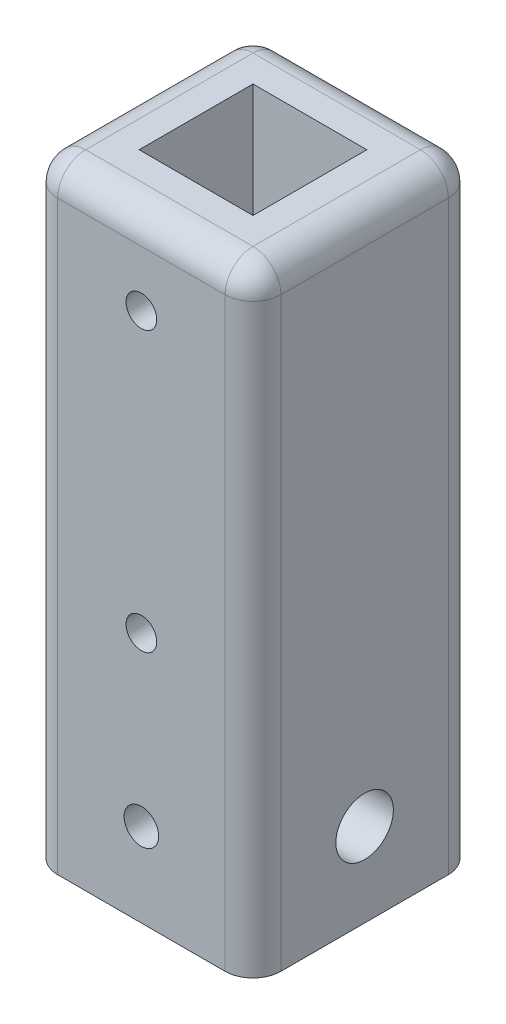
ISO-10303-21;
HEADER;
FILE_DESCRIPTION(('STEP AP214'),'2;1');
FILE_NAME('part.step','',(''),(''),'','','');
FILE_SCHEMA(('AUTOMOTIVE_DESIGN { 1 0 10303 214 1 1 1 1 }'));
ENDSEC;
DATA;
#1=APPLICATION_CONTEXT('core data for automotive mechanical design processes');
#2=APPLICATION_PROTOCOL_DEFINITION('international standard','automotive_design',2000,#1);
#3=PRODUCT_CONTEXT('',#1,'mechanical');
#4=PRODUCT('Part','Part','',(#3));
#5=PRODUCT_RELATED_PRODUCT_CATEGORY('part','',(#4));
#6=PRODUCT_DEFINITION_FORMATION('','',#4);
#7=PRODUCT_DEFINITION_CONTEXT('part definition',#1,'design');
#8=PRODUCT_DEFINITION('design','',#6,#7);
#9=PRODUCT_DEFINITION_SHAPE('','',#8);
#10=(LENGTH_UNIT() NAMED_UNIT(*) SI_UNIT(.MILLI.,.METRE.));
#11=(NAMED_UNIT(*) PLANE_ANGLE_UNIT() SI_UNIT($,.RADIAN.));
#12=(NAMED_UNIT(*) SI_UNIT($,.STERADIAN.) SOLID_ANGLE_UNIT());
#13=UNCERTAINTY_MEASURE_WITH_UNIT(LENGTH_MEASURE(1.E-05),#10,'distance_accuracy_value','');
#14=(GEOMETRIC_REPRESENTATION_CONTEXT(3) GLOBAL_UNCERTAINTY_ASSIGNED_CONTEXT((#13)) GLOBAL_UNIT_ASSIGNED_CONTEXT((#10,
#11,#12)) REPRESENTATION_CONTEXT('',''));
#15=CARTESIAN_POINT('',(0.,0.,0.));
#16=DIRECTION('',(0.,0.,1.));
#17=DIRECTION('',(1.,0.,0.));
#18=AXIS2_PLACEMENT_3D('',#15,#16,#17);
#19=CARTESIAN_POINT('',(0.,80.,0.));
#20=DIRECTION('',(0.,-1.,0.));
#21=DIRECTION('',(0.,0.,-1.));
#22=AXIS2_PLACEMENT_3D('',#19,#20,#21);
#23=PLANE('',#22);
#24=DIRECTION('',(0.,0.,-1.));
#25=VECTOR('',#24,1.);
#26=CARTESIAN_POINT('',(25.2,80.,0.));
#27=LINE('',#26,#25);
#28=CARTESIAN_POINT('',(25.2,80.,4.8));
#29=VERTEX_POINT('',#28);
#30=CARTESIAN_POINT('',(25.2,80.,-25.2));
#31=VERTEX_POINT('',#30);
#32=EDGE_CURVE('E223',#29,#31,#27,.T.);
#33=ORIENTED_EDGE('',*,*,#32,.T.);
#34=DIRECTION('',(-1.,0.,0.));
#35=VECTOR('',#34,1.);
#36=CARTESIAN_POINT('',(0.,80.,-25.2));
#37=LINE('',#36,#35);
#38=CARTESIAN_POINT('',(-4.80000000000001,80.,-25.2));
#39=VERTEX_POINT('',#38);
#40=EDGE_CURVE('E225',#31,#39,#37,.T.);
#41=ORIENTED_EDGE('',*,*,#40,.T.);
#42=DIRECTION('',(0.,0.,1.));
#43=VECTOR('',#42,1.);
#44=CARTESIAN_POINT('',(-4.8,80.,0.));
#45=LINE('',#44,#43);
#46=CARTESIAN_POINT('',(-4.8,80.,4.8));
#47=VERTEX_POINT('',#46);
#48=EDGE_CURVE('E219',#39,#47,#45,.T.);
#49=ORIENTED_EDGE('',*,*,#48,.T.);
#50=DIRECTION('',(1.,0.,0.));
#51=VECTOR('',#50,1.);
#52=CARTESIAN_POINT('',(0.,80.,4.8));
#53=LINE('',#52,#51);
#54=EDGE_CURVE('E221',#47,#29,#53,.T.);
#55=ORIENTED_EDGE('',*,*,#54,.T.);
#56=EDGE_LOOP('',(#33,#41,#49,#55));
#57=FACE_BOUND('',#56,.T.);
#58=DIRECTION('',(0.,0.,1.));
#59=VECTOR('',#58,1.);
#60=CARTESIAN_POINT('',(0.,80.,0.));
#61=LINE('',#60,#59);
#62=CARTESIAN_POINT('',(0.,80.,-20.4));
#63=VERTEX_POINT('',#62);
#64=CARTESIAN_POINT('',(0.,80.,0.));
#65=VERTEX_POINT('',#64);
#66=EDGE_CURVE('E151',#63,#65,#61,.T.);
#67=ORIENTED_EDGE('',*,*,#66,.F.);
#68=DIRECTION('',(-1.,0.,0.));
#69=VECTOR('',#68,1.);
#70=CARTESIAN_POINT('',(0.,80.,-20.4));
#71=LINE('',#70,#69);
#72=CARTESIAN_POINT('',(20.4,80.,-20.4));
#73=VERTEX_POINT('',#72);
#74=EDGE_CURVE('E171',#73,#63,#71,.T.);
#75=ORIENTED_EDGE('',*,*,#74,.F.);
#76=DIRECTION('',(0.,0.,-1.));
#77=VECTOR('',#76,1.);
#78=CARTESIAN_POINT('',(20.4,80.,0.));
#79=LINE('',#78,#77);
#80=CARTESIAN_POINT('',(20.4,80.,0.));
#81=VERTEX_POINT('',#80);
#82=EDGE_CURVE('E160',#81,#73,#79,.T.);
#83=ORIENTED_EDGE('',*,*,#82,.F.);
#84=DIRECTION('',(1.,0.,0.));
#85=VECTOR('',#84,1.);
#86=CARTESIAN_POINT('',(0.,80.,0.));
#87=LINE('',#86,#85);
#88=EDGE_CURVE('E293',#65,#81,#87,.T.);
#89=ORIENTED_EDGE('',*,*,#88,.F.);
#90=EDGE_LOOP('',(#67,#75,#83,#89));
#91=FACE_BOUND('',#90,.T.);
#92=ADVANCED_FACE('F38',(#57,#91),#23,.F.);
#93=CARTESIAN_POINT('',(-9.8,80.,9.8));
#94=DIRECTION('',(1.,0.,0.));
#95=DIRECTION('',(0.,0.,-1.));
#96=AXIS2_PLACEMENT_3D('',#93,#94,#95);
#97=PLANE('',#96);
#98=CARTESIAN_POINT('',(-9.8,-15.,-10.2));
#99=DIRECTION('',(-1.,0.,0.));
#100=DIRECTION('',(0.,0.,1.));
#101=AXIS2_PLACEMENT_3D('',#98,#99,#100);
#102=CIRCLE('',#101,5.15);
#103=CARTESIAN_POINT('',(-9.8,-15.,-5.04999999999999));
#104=VERTEX_POINT('',#103);
#105=EDGE_CURVE('E439',#104,#104,#102,.T.);
#106=ORIENTED_EDGE('',*,*,#105,.F.);
#107=EDGE_LOOP('',(#106));
#108=FACE_BOUND('',#107,.T.);
#109=DIRECTION('',(0.,-1.,0.));
#110=VECTOR('',#109,1.);
#111=CARTESIAN_POINT('',(-9.8,80.,4.8));
#112=LINE('',#111,#110);
#113=CARTESIAN_POINT('',(-9.8,-30.,4.8));
#114=VERTEX_POINT('',#113);
#115=CARTESIAN_POINT('',(-9.8,75.,4.8));
#116=VERTEX_POINT('',#115);
#117=EDGE_CURVE('E177',#114,#116,#112,.F.);
#118=ORIENTED_EDGE('',*,*,#117,.T.);
#119=DIRECTION('',(0.,0.,1.));
#120=VECTOR('',#119,1.);
#121=CARTESIAN_POINT('',(-9.8,75.,9.8));
#122=LINE('',#121,#120);
#123=CARTESIAN_POINT('',(-9.80000000000001,75.,-25.2));
#124=VERTEX_POINT('',#123);
#125=EDGE_CURVE('E11',#116,#124,#122,.F.);
#126=ORIENTED_EDGE('',*,*,#125,.T.);
#127=DIRECTION('',(0.,-1.,0.));
#128=VECTOR('',#127,1.);
#129=CARTESIAN_POINT('',(-9.80000000000001,80.,-25.2));
#130=LINE('',#129,#128);
#131=CARTESIAN_POINT('',(-9.80000000000001,-30.,-25.2));
#132=VERTEX_POINT('',#131);
#133=EDGE_CURVE('E188',#124,#132,#130,.T.);
#134=ORIENTED_EDGE('',*,*,#133,.T.);
#135=DIRECTION('',(0.,0.,-1.));
#136=VECTOR('',#135,1.);
#137=CARTESIAN_POINT('',(-9.8,-30.,0.));
#138=LINE('',#137,#136);
#139=EDGE_CURVE('E289',#114,#132,#138,.T.);
#140=ORIENTED_EDGE('',*,*,#139,.F.);
#141=EDGE_LOOP('',(#118,#126,#134,#140));
#142=FACE_BOUND('',#141,.T.);
#143=ADVANCED_FACE('F305',(#108,#142),#97,.F.);
#144=CARTESIAN_POINT('',(-9.8,80.,9.8));
#145=DIRECTION('',(0.,0.,-1.));
#146=DIRECTION('',(-1.,0.,0.));
#147=AXIS2_PLACEMENT_3D('',#144,#145,#146);
#148=PLANE('',#147);
#149=CARTESIAN_POINT('',(10.2,-15.,9.8));
#150=DIRECTION('',(0.,0.,1.));
#151=DIRECTION('',(1.,0.,0.));
#152=AXIS2_PLACEMENT_3D('',#149,#150,#151);
#153=CIRCLE('',#152,3.1);
#154=CARTESIAN_POINT('',(13.3,-15.,9.8));
#155=VERTEX_POINT('',#154);
#156=EDGE_CURVE('E390',#155,#155,#153,.T.);
#157=ORIENTED_EDGE('',*,*,#156,.F.);
#158=EDGE_LOOP('',(#157));
#159=FACE_BOUND('',#158,.T.);
#160=CARTESIAN_POINT('',(10.2,15.,9.8));
#161=DIRECTION('',(0.,0.,-1.));
#162=DIRECTION('',(-1.,0.,0.));
#163=AXIS2_PLACEMENT_3D('',#160,#161,#162);
#164=CIRCLE('',#163,2.75);
#165=CARTESIAN_POINT('',(7.45,15.,9.8));
#166=VERTEX_POINT('',#165);
#167=EDGE_CURVE('E182',#166,#166,#164,.T.);
#168=ORIENTED_EDGE('',*,*,#167,.T.);
#169=EDGE_LOOP('',(#168));
#170=FACE_BOUND('',#169,.T.);
#171=CARTESIAN_POINT('',(10.2,65.,9.8));
#172=DIRECTION('',(0.,0.,-1.));
#173=DIRECTION('',(-1.,0.,0.));
#174=AXIS2_PLACEMENT_3D('',#171,#172,#173);
#175=CIRCLE('',#174,2.75);
#176=CARTESIAN_POINT('',(7.44999999999999,65.,9.8));
#177=VERTEX_POINT('',#176);
#178=EDGE_CURVE('E427',#177,#177,#175,.T.);
#179=ORIENTED_EDGE('',*,*,#178,.T.);
#180=EDGE_LOOP('',(#179));
#181=FACE_BOUND('',#180,.T.);
#182=DIRECTION('',(0.,-1.,0.));
#183=VECTOR('',#182,1.);
#184=CARTESIAN_POINT('',(25.2,80.,9.8));
#185=LINE('',#184,#183);
#186=CARTESIAN_POINT('',(25.2,-30.,9.8));
#187=VERTEX_POINT('',#186);
#188=CARTESIAN_POINT('',(25.2,75.,9.8));
#189=VERTEX_POINT('',#188);
#190=EDGE_CURVE('E203',#187,#189,#185,.F.);
#191=ORIENTED_EDGE('',*,*,#190,.T.);
#192=DIRECTION('',(1.,0.,0.));
#193=VECTOR('',#192,1.);
#194=CARTESIAN_POINT('',(-9.8,75.,9.8));
#195=LINE('',#194,#193);
#196=CARTESIAN_POINT('',(-4.8,75.,9.8));
#197=VERTEX_POINT('',#196);
#198=EDGE_CURVE('E62',#189,#197,#195,.F.);
#199=ORIENTED_EDGE('',*,*,#198,.T.);
#200=DIRECTION('',(0.,-1.,0.));
#201=VECTOR('',#200,1.);
#202=CARTESIAN_POINT('',(-4.8,80.,9.8));
#203=LINE('',#202,#201);
#204=CARTESIAN_POINT('',(-4.8,-30.,9.8));
#205=VERTEX_POINT('',#204);
#206=EDGE_CURVE('E205',#197,#205,#203,.T.);
#207=ORIENTED_EDGE('',*,*,#206,.T.);
#208=DIRECTION('',(1.,0.,0.));
#209=VECTOR('',#208,1.);
#210=CARTESIAN_POINT('',(0.,-30.,9.8));
#211=LINE('',#210,#209);
#212=EDGE_CURVE('E275',#205,#187,#211,.T.);
#213=ORIENTED_EDGE('',*,*,#212,.T.);
#214=EDGE_LOOP('',(#191,#199,#207,#213));
#215=FACE_BOUND('',#214,.T.);
#216=ADVANCED_FACE('F273',(#159,#170,#181,#215),#148,.F.);
#217=CARTESIAN_POINT('',(30.2,80.,9.8));
#218=DIRECTION('',(-1.,0.,0.));
#219=DIRECTION('',(0.,0.,1.));
#220=AXIS2_PLACEMENT_3D('',#217,#218,#219);
#221=PLANE('',#220);
#222=CARTESIAN_POINT('',(30.2,-15.,-10.2));
#223=DIRECTION('',(-1.,0.,0.));
#224=DIRECTION('',(0.,0.,1.));
#225=AXIS2_PLACEMENT_3D('',#222,#223,#224);
#226=CIRCLE('',#225,5.15);
#227=CARTESIAN_POINT('',(30.2,-15.,-5.05));
#228=VERTEX_POINT('',#227);
#229=EDGE_CURVE('E434',#228,#228,#226,.T.);
#230=ORIENTED_EDGE('',*,*,#229,.T.);
#231=EDGE_LOOP('',(#230));
#232=FACE_BOUND('',#231,.T.);
#233=DIRECTION('',(0.,-1.,0.));
#234=VECTOR('',#233,1.);
#235=CARTESIAN_POINT('',(30.2,80.,-25.2));
#236=LINE('',#235,#234);
#237=CARTESIAN_POINT('',(30.2,-30.,-25.2));
#238=VERTEX_POINT('',#237);
#239=CARTESIAN_POINT('',(30.2,75.,-25.2));
#240=VERTEX_POINT('',#239);
#241=EDGE_CURVE('E207',#238,#240,#236,.F.);
#242=ORIENTED_EDGE('',*,*,#241,.T.);
#243=DIRECTION('',(0.,0.,-1.));
#244=VECTOR('',#243,1.);
#245=CARTESIAN_POINT('',(30.2,75.,9.8));
#246=LINE('',#245,#244);
#247=CARTESIAN_POINT('',(30.2,75.,4.8));
#248=VERTEX_POINT('',#247);
#249=EDGE_CURVE('E232',#240,#248,#246,.F.);
#250=ORIENTED_EDGE('',*,*,#249,.T.);
#251=DIRECTION('',(0.,-1.,0.));
#252=VECTOR('',#251,1.);
#253=CARTESIAN_POINT('',(30.2,80.,4.8));
#254=LINE('',#253,#252);
#255=CARTESIAN_POINT('',(30.2,-30.,4.8));
#256=VERTEX_POINT('',#255);
#257=EDGE_CURVE('E210',#248,#256,#254,.T.);
#258=ORIENTED_EDGE('',*,*,#257,.T.);
#259=DIRECTION('',(0.,0.,-1.));
#260=VECTOR('',#259,1.);
#261=CARTESIAN_POINT('',(30.2,-30.,0.));
#262=LINE('',#261,#260);
#263=EDGE_CURVE('E278',#256,#238,#262,.T.);
#264=ORIENTED_EDGE('',*,*,#263,.T.);
#265=EDGE_LOOP('',(#242,#250,#258,#264));
#266=FACE_BOUND('',#265,.T.);
#267=ADVANCED_FACE('F319',(#232,#266),#221,.F.);
#268=CARTESIAN_POINT('',(-9.80000000000001,80.,-30.2));
#269=DIRECTION('',(0.,0.,1.));
#270=DIRECTION('',(1.,0.,0.));
#271=AXIS2_PLACEMENT_3D('',#268,#269,#270);
#272=PLANE('',#271);
#273=CARTESIAN_POINT('',(10.2,15.,-30.2));
#274=DIRECTION('',(0.,0.,-1.));
#275=DIRECTION('',(-1.,0.,0.));
#276=AXIS2_PLACEMENT_3D('',#273,#274,#275);
#277=CIRCLE('',#276,2.75);
#278=CARTESIAN_POINT('',(7.45,15.,-30.2));
#279=VERTEX_POINT('',#278);
#280=EDGE_CURVE('E430',#279,#279,#277,.T.);
#281=ORIENTED_EDGE('',*,*,#280,.F.);
#282=EDGE_LOOP('',(#281));
#283=FACE_BOUND('',#282,.T.);
#284=CARTESIAN_POINT('',(10.2,65.,-30.2));
#285=DIRECTION('',(0.,0.,-1.));
#286=DIRECTION('',(-1.,0.,0.));
#287=AXIS2_PLACEMENT_3D('',#284,#285,#286);
#288=CIRCLE('',#287,2.75);
#289=CARTESIAN_POINT('',(7.44999999999999,65.,-30.2));
#290=VERTEX_POINT('',#289);
#291=EDGE_CURVE('E431',#290,#290,#288,.T.);
#292=ORIENTED_EDGE('',*,*,#291,.F.);
#293=EDGE_LOOP('',(#292));
#294=FACE_BOUND('',#293,.T.);
#295=DIRECTION('',(0.,-1.,0.));
#296=VECTOR('',#295,1.);
#297=CARTESIAN_POINT('',(-4.80000000000001,80.,-30.2));
#298=LINE('',#297,#296);
#299=CARTESIAN_POINT('',(-4.80000000000001,-30.,-30.2));
#300=VERTEX_POINT('',#299);
#301=CARTESIAN_POINT('',(-4.80000000000001,75.,-30.2));
#302=VERTEX_POINT('',#301);
#303=EDGE_CURVE('E200',#300,#302,#298,.F.);
#304=ORIENTED_EDGE('',*,*,#303,.T.);
#305=DIRECTION('',(-1.,0.,0.));
#306=VECTOR('',#305,1.);
#307=CARTESIAN_POINT('',(-9.80000000000001,75.,-30.2));
#308=LINE('',#307,#306);
#309=CARTESIAN_POINT('',(25.2,75.,-30.2));
#310=VERTEX_POINT('',#309);
#311=EDGE_CURVE('E228',#302,#310,#308,.F.);
#312=ORIENTED_EDGE('',*,*,#311,.T.);
#313=DIRECTION('',(0.,-1.,0.));
#314=VECTOR('',#313,1.);
#315=CARTESIAN_POINT('',(25.2,80.,-30.2));
#316=LINE('',#315,#314);
#317=CARTESIAN_POINT('',(25.2,-30.,-30.2));
#318=VERTEX_POINT('',#317);
#319=EDGE_CURVE('E198',#310,#318,#316,.T.);
#320=ORIENTED_EDGE('',*,*,#319,.T.);
#321=DIRECTION('',(1.,0.,0.));
#322=VECTOR('',#321,1.);
#323=CARTESIAN_POINT('',(0.,-30.,-30.2));
#324=LINE('',#323,#322);
#325=EDGE_CURVE('E281',#300,#318,#324,.T.);
#326=ORIENTED_EDGE('',*,*,#325,.F.);
#327=EDGE_LOOP('',(#304,#312,#320,#326));
#328=FACE_BOUND('',#327,.T.);
#329=ADVANCED_FACE('F316',(#283,#294,#328),#272,.F.);
#330=CARTESIAN_POINT('',(0.,80.,0.));
#331=DIRECTION('',(1.,0.,0.));
#332=DIRECTION('',(0.,0.,-1.));
#333=AXIS2_PLACEMENT_3D('',#330,#331,#332);
#334=PLANE('',#333);
#335=DIRECTION('',(0.,0.,1.));
#336=VECTOR('',#335,1.);
#337=CARTESIAN_POINT('',(0.,0.,0.));
#338=LINE('',#337,#336);
#339=CARTESIAN_POINT('',(0.,0.,-20.4));
#340=VERTEX_POINT('',#339);
#341=CARTESIAN_POINT('',(0.,0.,0.));
#342=VERTEX_POINT('',#341);
#343=EDGE_CURVE('E167',#340,#342,#338,.T.);
#344=ORIENTED_EDGE('',*,*,#343,.F.);
#345=DIRECTION('',(0.,-1.,0.));
#346=VECTOR('',#345,1.);
#347=CARTESIAN_POINT('',(0.,80.,-20.4));
#348=LINE('',#347,#346);
#349=EDGE_CURVE('E147',#63,#340,#348,.T.);
#350=ORIENTED_EDGE('',*,*,#349,.F.);
#351=ORIENTED_EDGE('',*,*,#66,.T.);
#352=DIRECTION('',(0.,-1.,0.));
#353=VECTOR('',#352,1.);
#354=CARTESIAN_POINT('',(0.,80.,0.));
#355=LINE('',#354,#353);
#356=EDGE_CURVE('E174',#65,#342,#355,.T.);
#357=ORIENTED_EDGE('',*,*,#356,.T.);
#358=EDGE_LOOP('',(#344,#350,#351,#357));
#359=FACE_BOUND('',#358,.T.);
#360=ADVANCED_FACE('F297',(#359),#334,.T.);
#361=CARTESIAN_POINT('',(0.,80.,0.));
#362=DIRECTION('',(0.,0.,-1.));
#363=DIRECTION('',(-1.,0.,0.));
#364=AXIS2_PLACEMENT_3D('',#361,#362,#363);
#365=PLANE('',#364);
#366=CARTESIAN_POINT('',(10.2,15.,0.));
#367=DIRECTION('',(0.,0.,-1.));
#368=DIRECTION('',(-1.,0.,0.));
#369=AXIS2_PLACEMENT_3D('',#366,#367,#368);
#370=CIRCLE('',#369,2.75);
#371=CARTESIAN_POINT('',(7.45,15.,0.));
#372=VERTEX_POINT('',#371);
#373=EDGE_CURVE('E186',#372,#372,#370,.T.);
#374=ORIENTED_EDGE('',*,*,#373,.F.);
#375=EDGE_LOOP('',(#374));
#376=FACE_BOUND('',#375,.T.);
#377=CARTESIAN_POINT('',(10.2,65.,0.));
#378=DIRECTION('',(0.,0.,-1.));
#379=DIRECTION('',(-1.,0.,0.));
#380=AXIS2_PLACEMENT_3D('',#377,#378,#379);
#381=CIRCLE('',#380,2.75);
#382=CARTESIAN_POINT('',(7.44999999999999,65.,0.));
#383=VERTEX_POINT('',#382);
#384=EDGE_CURVE('E181',#383,#383,#381,.T.);
#385=ORIENTED_EDGE('',*,*,#384,.F.);
#386=EDGE_LOOP('',(#385));
#387=FACE_BOUND('',#386,.T.);
#388=DIRECTION('',(1.,0.,0.));
#389=VECTOR('',#388,1.);
#390=CARTESIAN_POINT('',(0.,0.,0.));
#391=LINE('',#390,#389);
#392=CARTESIAN_POINT('',(20.4,0.,0.));
#393=VERTEX_POINT('',#392);
#394=EDGE_CURVE('E165',#342,#393,#391,.T.);
#395=ORIENTED_EDGE('',*,*,#394,.F.);
#396=ORIENTED_EDGE('',*,*,#356,.F.);
#397=ORIENTED_EDGE('',*,*,#88,.T.);
#398=DIRECTION('',(0.,-1.,0.));
#399=VECTOR('',#398,1.);
#400=CARTESIAN_POINT('',(20.4,80.,0.));
#401=LINE('',#400,#399);
#402=EDGE_CURVE('E162',#81,#393,#401,.T.);
#403=ORIENTED_EDGE('',*,*,#402,.T.);
#404=EDGE_LOOP('',(#395,#396,#397,#403));
#405=FACE_BOUND('',#404,.T.);
#406=ADVANCED_FACE('F302',(#376,#387,#405),#365,.T.);
#407=CARTESIAN_POINT('',(20.4,80.,0.));
#408=DIRECTION('',(-1.,0.,0.));
#409=DIRECTION('',(0.,0.,1.));
#410=AXIS2_PLACEMENT_3D('',#407,#408,#409);
#411=PLANE('',#410);
#412=DIRECTION('',(0.,0.,-1.));
#413=VECTOR('',#412,1.);
#414=CARTESIAN_POINT('',(20.4,0.,0.));
#415=LINE('',#414,#413);
#416=CARTESIAN_POINT('',(20.4,0.,-20.4));
#417=VERTEX_POINT('',#416);
#418=EDGE_CURVE('E152',#393,#417,#415,.T.);
#419=ORIENTED_EDGE('',*,*,#418,.F.);
#420=ORIENTED_EDGE('',*,*,#402,.F.);
#421=ORIENTED_EDGE('',*,*,#82,.T.);
#422=DIRECTION('',(0.,-1.,0.));
#423=VECTOR('',#422,1.);
#424=CARTESIAN_POINT('',(20.4,80.,-20.4));
#425=LINE('',#424,#423);
#426=EDGE_CURVE('E144',#73,#417,#425,.T.);
#427=ORIENTED_EDGE('',*,*,#426,.T.);
#428=EDGE_LOOP('',(#419,#420,#421,#427));
#429=FACE_BOUND('',#428,.T.);
#430=ADVANCED_FACE('F156',(#429),#411,.T.);
#431=CARTESIAN_POINT('',(0.,80.,-20.4));
#432=DIRECTION('',(0.,0.,1.));
#433=DIRECTION('',(1.,0.,0.));
#434=AXIS2_PLACEMENT_3D('',#431,#432,#433);
#435=PLANE('',#434);
#436=CARTESIAN_POINT('',(10.2,15.,-20.4));
#437=DIRECTION('',(0.,0.,1.));
#438=DIRECTION('',(1.,0.,0.));
#439=AXIS2_PLACEMENT_3D('',#436,#437,#438);
#440=CIRCLE('',#439,2.75);
#441=CARTESIAN_POINT('',(12.95,15.,-20.4));
#442=VERTEX_POINT('',#441);
#443=EDGE_CURVE('E183',#442,#442,#440,.T.);
#444=ORIENTED_EDGE('',*,*,#443,.F.);
#445=EDGE_LOOP('',(#444));
#446=FACE_BOUND('',#445,.T.);
#447=CARTESIAN_POINT('',(10.2,65.,-20.4));
#448=DIRECTION('',(0.,0.,1.));
#449=DIRECTION('',(1.,0.,0.));
#450=AXIS2_PLACEMENT_3D('',#447,#448,#449);
#451=CIRCLE('',#450,2.75);
#452=CARTESIAN_POINT('',(12.95,65.,-20.4));
#453=VERTEX_POINT('',#452);
#454=EDGE_CURVE('E178',#453,#453,#451,.T.);
#455=ORIENTED_EDGE('',*,*,#454,.F.);
#456=EDGE_LOOP('',(#455));
#457=FACE_BOUND('',#456,.T.);
#458=DIRECTION('',(-1.,0.,0.));
#459=VECTOR('',#458,1.);
#460=CARTESIAN_POINT('',(0.,0.,-20.4));
#461=LINE('',#460,#459);
#462=EDGE_CURVE('E141',#417,#340,#461,.T.);
#463=ORIENTED_EDGE('',*,*,#462,.F.);
#464=ORIENTED_EDGE('',*,*,#426,.F.);
#465=ORIENTED_EDGE('',*,*,#74,.T.);
#466=ORIENTED_EDGE('',*,*,#349,.T.);
#467=EDGE_LOOP('',(#463,#464,#465,#466));
#468=FACE_BOUND('',#467,.T.);
#469=ADVANCED_FACE('F143',(#446,#457,#468),#435,.T.);
#470=CARTESIAN_POINT('',(0.,0.,0.));
#471=DIRECTION('',(0.,1.,0.));
#472=DIRECTION('',(0.,0.,1.));
#473=AXIS2_PLACEMENT_3D('',#470,#471,#472);
#474=PLANE('',#473);
#475=ORIENTED_EDGE('',*,*,#418,.T.);
#476=ORIENTED_EDGE('',*,*,#462,.T.);
#477=ORIENTED_EDGE('',*,*,#343,.T.);
#478=ORIENTED_EDGE('',*,*,#394,.T.);
#479=EDGE_LOOP('',(#475,#476,#477,#478));
#480=FACE_BOUND('',#479,.T.);
#481=ADVANCED_FACE('F164',(#480),#474,.T.);
#482=CARTESIAN_POINT('',(0.,-30.,0.));
#483=DIRECTION('',(0.,1.,0.));
#484=DIRECTION('',(0.,0.,1.));
#485=AXIS2_PLACEMENT_3D('',#482,#483,#484);
#486=PLANE('',#485);
#487=ORIENTED_EDGE('',*,*,#139,.T.);
#488=CARTESIAN_POINT('',(-4.80000000000001,-30.,-25.2));
#489=DIRECTION('',(0.,1.,0.));
#490=DIRECTION('',(0.,0.,1.));
#491=AXIS2_PLACEMENT_3D('',#488,#489,#490);
#492=CIRCLE('',#491,5.);
#493=EDGE_CURVE('E196',#132,#300,#492,.F.);
#494=ORIENTED_EDGE('',*,*,#493,.T.);
#495=ORIENTED_EDGE('',*,*,#325,.T.);
#496=CARTESIAN_POINT('',(25.2,-30.,-25.2));
#497=DIRECTION('',(0.,1.,0.));
#498=DIRECTION('',(0.,0.,1.));
#499=AXIS2_PLACEMENT_3D('',#496,#497,#498);
#500=CIRCLE('',#499,5.);
#501=EDGE_CURVE('E190',#318,#238,#500,.F.);
#502=ORIENTED_EDGE('',*,*,#501,.T.);
#503=ORIENTED_EDGE('',*,*,#263,.F.);
#504=CARTESIAN_POINT('',(25.2,-30.,4.8));
#505=DIRECTION('',(0.,1.,0.));
#506=DIRECTION('',(0.,0.,1.));
#507=AXIS2_PLACEMENT_3D('',#504,#505,#506);
#508=CIRCLE('',#507,5.);
#509=EDGE_CURVE('E192',#256,#187,#508,.F.);
#510=ORIENTED_EDGE('',*,*,#509,.T.);
#511=ORIENTED_EDGE('',*,*,#212,.F.);
#512=CARTESIAN_POINT('',(-4.8,-30.,4.8));
#513=DIRECTION('',(0.,1.,0.));
#514=DIRECTION('',(0.,0.,1.));
#515=AXIS2_PLACEMENT_3D('',#512,#513,#514);
#516=CIRCLE('',#515,5.);
#517=EDGE_CURVE('E194',#205,#114,#516,.F.);
#518=ORIENTED_EDGE('',*,*,#517,.T.);
#519=EDGE_LOOP('',(#487,#494,#495,#502,#503,#510,#511,#518));
#520=FACE_BOUND('',#519,.T.);
#521=ADVANCED_FACE('F406',(#520),#486,.F.);
#522=CARTESIAN_POINT('',(10.2,65.,9.8));
#523=DIRECTION('',(0.,0.,-1.));
#524=DIRECTION('',(-1.,0.,0.));
#525=AXIS2_PLACEMENT_3D('',#522,#523,#524);
#526=CYLINDRICAL_SURFACE('',#525,2.75);
#527=ORIENTED_EDGE('',*,*,#454,.T.);
#528=EDGE_LOOP('',(#527));
#529=FACE_BOUND('',#528,.T.);
#530=ORIENTED_EDGE('',*,*,#291,.T.);
#531=EDGE_LOOP('',(#530));
#532=FACE_BOUND('',#531,.T.);
#533=ADVANCED_FACE('F402',(#529,#532),#526,.F.);
#534=CARTESIAN_POINT('',(10.2,15.,9.8));
#535=DIRECTION('',(0.,0.,-1.));
#536=DIRECTION('',(-1.,0.,0.));
#537=AXIS2_PLACEMENT_3D('',#534,#535,#536);
#538=CYLINDRICAL_SURFACE('',#537,2.75);
#539=ORIENTED_EDGE('',*,*,#443,.T.);
#540=EDGE_LOOP('',(#539));
#541=FACE_BOUND('',#540,.T.);
#542=ORIENTED_EDGE('',*,*,#280,.T.);
#543=EDGE_LOOP('',(#542));
#544=FACE_BOUND('',#543,.T.);
#545=ADVANCED_FACE('F398',(#541,#544),#538,.F.);
#546=ORIENTED_EDGE('',*,*,#384,.T.);
#547=EDGE_LOOP('',(#546));
#548=FACE_BOUND('',#547,.T.);
#549=ORIENTED_EDGE('',*,*,#178,.F.);
#550=EDGE_LOOP('',(#549));
#551=FACE_BOUND('',#550,.T.);
#552=ADVANCED_FACE('F401',(#548,#551),#526,.F.);
#553=ORIENTED_EDGE('',*,*,#373,.T.);
#554=EDGE_LOOP('',(#553));
#555=FACE_BOUND('',#554,.T.);
#556=ORIENTED_EDGE('',*,*,#167,.F.);
#557=EDGE_LOOP('',(#556));
#558=FACE_BOUND('',#557,.T.);
#559=ADVANCED_FACE('F396',(#555,#558),#538,.F.);
#560=CARTESIAN_POINT('',(30.2,-15.,-10.2));
#561=DIRECTION('',(-1.,0.,0.));
#562=DIRECTION('',(0.,0.,1.));
#563=AXIS2_PLACEMENT_3D('',#560,#561,#562);
#564=CYLINDRICAL_SURFACE('',#563,5.15);
#565=CARTESIAN_POINT('',(12.95,-15.,-5.05));
#566=CARTESIAN_POINT('',(12.9499888359247,-14.8566355820442,-5.05000970391246));
#567=CARTESIAN_POINT('',(12.9387227245238,-14.713129859326,-5.05604917896951));
#568=CARTESIAN_POINT('',(12.8941886831021,-14.4304392733083,-5.07961808963868));
#569=CARTESIAN_POINT('',(12.860886832335,-14.2912614184923,-5.09716523923498));
#570=CARTESIAN_POINT('',(12.7739951220921,-14.0217260635812,-5.14192982949456));
#571=CARTESIAN_POINT('',(12.7204874407955,-13.8913353240309,-5.16910807277808));
#572=CARTESIAN_POINT('',(12.5951699483017,-13.6416193919758,-5.2307075505119));
#573=CARTESIAN_POINT('',(12.5233600259595,-13.5222942666758,-5.26512882894712));
#574=CARTESIAN_POINT('',(12.3581141345159,-13.2892148929835,-5.3408123752387));
#575=CARTESIAN_POINT('',(12.2635612396754,-13.1763523438415,-5.3823766644147));
#576=CARTESIAN_POINT('',(12.0579410440971,-12.9672477978772,-5.46680241910344));
#577=CARTESIAN_POINT('',(11.9468594020701,-12.8710203929803,-5.5096649850947));
#578=CARTESIAN_POINT('',(11.6992482503838,-12.6890507378827,-5.59640645119969));
#579=CARTESIAN_POINT('',(11.5613203383058,-12.605073112257,-5.64001958866425));
#580=CARTESIAN_POINT('',(11.2706639678842,-12.4618292299312,-5.71815828294481));
#581=CARTESIAN_POINT('',(11.1179470724709,-12.4025438565377,-5.75269086224637));
#582=CARTESIAN_POINT('',(10.8860693452194,-12.335834635952,-5.79258338691981));
#583=CARTESIAN_POINT('',(10.8108747946772,-12.3175840224364,-5.8037001746156));
#584=CARTESIAN_POINT('',(10.658791383623,-12.2874355067025,-5.82223658659017));
#585=CARTESIAN_POINT('',(10.5819035132526,-12.2755339895313,-5.8296583145454));
#586=CARTESIAN_POINT('',(10.4271742444612,-12.2582951120764,-5.84045189770228));
#587=CARTESIAN_POINT('',(10.3493336880901,-12.2529523259462,-5.84382710042181));
#588=CARTESIAN_POINT('',(10.1934372384701,-12.2489010353803,-5.84638624615975));
#589=CARTESIAN_POINT('',(10.1153813725959,-12.2501917231974,-5.84557069947882));
#590=CARTESIAN_POINT('',(9.90405830549893,-12.2627102919727,-5.83767455451596));
#591=CARTESIAN_POINT('',(9.77125577890621,-12.2803886889081,-5.82652806093394));
#592=CARTESIAN_POINT('',(9.51098559315801,-12.3343893385672,-5.79341588485659));
#593=CARTESIAN_POINT('',(9.38352011287643,-12.3707191270682,-5.77144582943038));
#594=CARTESIAN_POINT('',(9.13383583316662,-12.4615289366554,-5.71876513862628));
#595=CARTESIAN_POINT('',(9.01179892069368,-12.5163979033513,-5.68786945196295));
#596=CARTESIAN_POINT('',(8.77805226833861,-12.6424118291447,-5.62076779045417));
#597=CARTESIAN_POINT('',(8.66634713218093,-12.7135639952613,-5.58455946676537));
#598=CARTESIAN_POINT('',(8.4391011303034,-12.8823124460171,-5.50448700776171));
#599=CARTESIAN_POINT('',(8.32542035340323,-12.9822604026308,-5.46028093823391));
#600=CARTESIAN_POINT('',(8.11559639698952,-13.1998276492432,-5.37344766763193));
#601=CARTESIAN_POINT('',(8.01946396810643,-13.3174576918853,-5.33082144707684));
#602=CARTESIAN_POINT('',(7.84196606694315,-13.5758619520638,-5.24886308698125));
#603=CARTESIAN_POINT('',(7.76182835506895,-13.7175998602728,-5.20988066148993));
#604=CARTESIAN_POINT('',(7.62723108597208,-14.0151386150021,-5.14275524058993));
#605=CARTESIAN_POINT('',(7.57274856229364,-14.1709267343519,-5.1146025545774));
#606=CARTESIAN_POINT('',(7.49597696112655,-14.4771365884062,-5.07449755616608));
#607=CARTESIAN_POINT('',(7.47123146941373,-14.6267790973794,-5.06131509148775));
#608=CARTESIAN_POINT('',(7.44676616496393,-14.928642333209,-5.04828404399486));
#609=CARTESIAN_POINT('',(7.44703182383946,-15.0808615119573,-5.04842772033855));
#610=CARTESIAN_POINT('',(7.47136134904651,-15.3687714154663,-5.06138235322101));
#611=CARTESIAN_POINT('',(7.49325796182909,-15.5047059757639,-5.0730397079403));
#612=CARTESIAN_POINT('',(7.55665006738609,-15.7706433510613,-5.10622234918685));
#613=CARTESIAN_POINT('',(7.59814759681652,-15.9006455481123,-5.12774866115275));
#614=CARTESIAN_POINT('',(7.70038627834954,-16.1548483755173,-5.17943430544836));
#615=CARTESIAN_POINT('',(7.76157996652407,-16.2788245878419,-5.20979485673458));
#616=CARTESIAN_POINT('',(7.90091459726812,-16.5151049494964,-5.2763785480798));
#617=CARTESIAN_POINT('',(7.97906213814428,-16.6274045291288,-5.31260396930348));
#618=CARTESIAN_POINT('',(8.15975841566059,-16.8500318210663,-5.39216104016087));
#619=CARTESIAN_POINT('',(8.26402983123389,-16.9588406666299,-5.43583773679193));
#620=CARTESIAN_POINT('',(8.489049352573,-17.1581932955569,-5.52276239924104));
#621=CARTESIAN_POINT('',(8.60981262477548,-17.2487200739501,-5.56600993065172));
#622=CARTESIAN_POINT('',(8.8746313455659,-17.4149295590513,-5.65028648008893));
#623=CARTESIAN_POINT('',(9.01971026810346,-17.4891920729843,-5.69096698788758));
#624=CARTESIAN_POINT('',(9.2470341202552,-17.5809018697321,-5.74324309691398));
#625=CARTESIAN_POINT('',(9.32443133595712,-17.6081922044491,-5.75921173220186));
#626=CARTESIAN_POINT('',(9.48194251237236,-17.6558704574037,-5.78756036526559));
#627=CARTESIAN_POINT('',(9.56205458576033,-17.6762630667615,-5.79994280117661));
#628=CARTESIAN_POINT('',(9.71639294463161,-17.7081760397178,-5.81952081394203));
#629=CARTESIAN_POINT('',(9.79043205967962,-17.7203673230266,-5.82710424782154));
#630=CARTESIAN_POINT('',(9.93950990850474,-17.7386639314438,-5.83853957857939));
#631=CARTESIAN_POINT('',(10.0145480746884,-17.7447725743302,-5.84239350968386));
#632=CARTESIAN_POINT('',(10.1649501937341,-17.7508055562119,-5.8461989685793));
#633=CARTESIAN_POINT('',(10.2403140238451,-17.7507320513444,-5.84615185693055));
#634=CARTESIAN_POINT('',(10.3906556805383,-17.7444160808257,-5.8421693719685));
#635=CARTESIAN_POINT('',(10.4656335324495,-17.7381740252963,-5.83823425715268));
#636=CARTESIAN_POINT('',(10.6707440256012,-17.7125977405677,-5.82224691411408));
#637=CARTESIAN_POINT('',(10.7998493662829,-17.6869414898528,-5.8063120143937));
#638=CARTESIAN_POINT('',(11.0515967271756,-17.6180848321293,-5.76494539694949));
#639=CARTESIAN_POINT('',(11.1742363226296,-17.5748778954698,-5.73951014494771));
#640=CARTESIAN_POINT('',(11.4185094675361,-17.469121900345,-5.68006231523735));
#641=CARTESIAN_POINT('',(11.5395708856016,-17.4055074613501,-5.64560325382549));
#642=CARTESIAN_POINT('',(11.7701058978858,-17.2618023683332,-5.57255494002189));
#643=CARTESIAN_POINT('',(11.879573205304,-17.1817028440021,-5.53396346944502));
#644=CARTESIAN_POINT('',(12.1003975172634,-16.9937240279114,-5.45030516214385));
#645=CARTESIAN_POINT('',(12.209723470044,-16.8835002290312,-5.40511133738371));
#646=CARTESIAN_POINT('',(12.4089391688736,-16.6453644010268,-5.31826143728223));
#647=CARTESIAN_POINT('',(12.4988162830726,-16.5174409640261,-5.27660767177809));
#648=CARTESIAN_POINT('',(12.6583355873663,-16.2429062283482,-5.20016250426923));
#649=CARTESIAN_POINT('',(12.7274251770475,-16.0959124057036,-5.1655652794673));
#650=CARTESIAN_POINT('',(12.8110900819543,-15.8667979167759,-5.12287106215569));
#651=CARTESIAN_POINT('',(12.8356412305989,-15.7890392186639,-5.11017820604178));
#652=CARTESIAN_POINT('',(12.8778216624251,-15.6312114984662,-5.0882097683172));
#653=CARTESIAN_POINT('',(12.8954547752029,-15.5511437810058,-5.07893229623858));
#654=CARTESIAN_POINT('',(12.9229244138982,-15.3928791603546,-5.06441948051746));
#655=CARTESIAN_POINT('',(12.9330623606866,-15.3147488797499,-5.05902811416027));
#656=CARTESIAN_POINT('',(12.9466032636251,-15.157760004862,-5.05181568357173));
#657=CARTESIAN_POINT('',(12.9500061442108,-15.0789014024174,-5.04999465939797));
#658=CARTESIAN_POINT('',(12.95,-15.,-5.05));
#659=B_SPLINE_CURVE_WITH_KNOTS('',3,(#565,#566,#567,#568,#569,#570,#571,#572,#573,#574,#575,
#576,#577,#578,#579,#580,#581,#582,#583,#584,#585,#586,#587,#588,#589,#590,#591,#592,#593,#594,
#595,#596,#597,#598,#599,#600,#601,#602,#603,#604,#605,#606,#607,#608,#609,#610,#611,#612,#613,
#614,#615,#616,#617,#618,#619,#620,#621,#622,#623,#624,#625,#626,#627,#628,#629,#630,#631,#632,
#633,#634,#635,#636,#637,#638,#639,#640,#641,#642,#643,#644,#645,#646,#647,#648,#649,#650,#651,
#652,#653,#654,#655,#656,#657,#658),.UNSPECIFIED.,.T.,.F.,(4,2,2,2,2,2,2,2,2,2,2,2,2,2,2,2,2,2,
2,2,2,2,2,2,2,2,2,2,2,2,2,2,2,2,2,2,2,2,2,2,2,2,2,2,2,2,4),(0.,0.429787082205002,
0.860237301678862,1.28895538969088,1.71767608126367,2.17477752081299,2.63227790575273,
3.13163294840771,3.63060066949418,3.8648174156452,4.09890066428051,4.33279013190563,
4.56665111986999,4.96787460317342,5.36926032172253,5.77965188172664,6.1902254354314,
6.66129614312614,7.13265448098842,7.63221660992106,8.13133067798,8.58551751222136,
9.03944052167129,9.45206763953433,9.86473764133226,10.2876614768501,10.7107502072417,
11.1794686458718,11.6486210726362,12.1495409807096,12.4000315143728,12.6503513460968,
12.8762786434513,13.1020826410754,13.3278078857421,13.5535181238673,13.9493667219402,
14.3453627287224,14.7668304928468,15.1885256364358,15.6714160987008,16.1546192589458,
16.6497176675641,16.896965208426,17.1440756874401,17.3806087376439,17.6171444416239),.UNSPECIFIED.);
#660=CARTESIAN_POINT('',(12.95,-15.,-5.05));
#661=VERTEX_POINT('',#660);
#662=EDGE_CURVE('E216',#661,#661,#659,.T.);
#663=ORIENTED_EDGE('',*,*,#662,.T.);
#664=EDGE_LOOP('',(#663));
#665=FACE_BOUND('',#664,.T.);
#666=ORIENTED_EDGE('',*,*,#229,.F.);
#667=EDGE_LOOP('',(#666));
#668=FACE_BOUND('',#667,.T.);
#669=ORIENTED_EDGE('',*,*,#105,.T.);
#670=EDGE_LOOP('',(#669));
#671=FACE_BOUND('',#670,.T.);
#672=ADVANCED_FACE('F331',(#665,#668,#671),#564,.F.);
#673=CARTESIAN_POINT('',(-4.80000000000001,80.,-25.2));
#674=DIRECTION('',(0.,-1.,0.));
#675=DIRECTION('',(0.,0.,-1.));
#676=AXIS2_PLACEMENT_3D('',#673,#674,#675);
#677=CYLINDRICAL_SURFACE('',#676,5.);
#678=ORIENTED_EDGE('',*,*,#133,.F.);
#679=CARTESIAN_POINT('',(-4.80000000000001,75.,-25.2));
#680=DIRECTION('',(0.,-1.,0.));
#681=DIRECTION('',(0.,0.,-1.));
#682=AXIS2_PLACEMENT_3D('',#679,#680,#681);
#683=CIRCLE('',#682,5.);
#684=EDGE_CURVE('E212',#124,#302,#683,.T.);
#685=ORIENTED_EDGE('',*,*,#684,.T.);
#686=ORIENTED_EDGE('',*,*,#303,.F.);
#687=ORIENTED_EDGE('',*,*,#493,.F.);
#688=EDGE_LOOP('',(#678,#685,#686,#687));
#689=FACE_BOUND('',#688,.T.);
#690=ADVANCED_FACE('F327',(#689),#677,.T.);
#691=CARTESIAN_POINT('',(-4.8,80.,4.8));
#692=DIRECTION('',(0.,-1.,0.));
#693=DIRECTION('',(0.,0.,-1.));
#694=AXIS2_PLACEMENT_3D('',#691,#692,#693);
#695=CYLINDRICAL_SURFACE('',#694,5.);
#696=ORIENTED_EDGE('',*,*,#206,.F.);
#697=CARTESIAN_POINT('',(-4.8,75.,4.8));
#698=DIRECTION('',(0.,-1.,0.));
#699=DIRECTION('',(0.,0.,-1.));
#700=AXIS2_PLACEMENT_3D('',#697,#698,#699);
#701=CIRCLE('',#700,5.);
#702=EDGE_CURVE('E47',#197,#116,#701,.T.);
#703=ORIENTED_EDGE('',*,*,#702,.T.);
#704=ORIENTED_EDGE('',*,*,#117,.F.);
#705=ORIENTED_EDGE('',*,*,#517,.F.);
#706=EDGE_LOOP('',(#696,#703,#704,#705));
#707=FACE_BOUND('',#706,.T.);
#708=ADVANCED_FACE('F330',(#707),#695,.T.);
#709=CARTESIAN_POINT('',(25.2,80.,4.8));
#710=DIRECTION('',(0.,-1.,0.));
#711=DIRECTION('',(0.,0.,-1.));
#712=AXIS2_PLACEMENT_3D('',#709,#710,#711);
#713=CYLINDRICAL_SURFACE('',#712,5.);
#714=ORIENTED_EDGE('',*,*,#257,.F.);
#715=CARTESIAN_POINT('',(25.2,75.,4.8));
#716=DIRECTION('',(0.,-1.,0.));
#717=DIRECTION('',(0.,0.,-1.));
#718=AXIS2_PLACEMENT_3D('',#715,#716,#717);
#719=CIRCLE('',#718,5.);
#720=EDGE_CURVE('E234',#248,#189,#719,.T.);
#721=ORIENTED_EDGE('',*,*,#720,.T.);
#722=ORIENTED_EDGE('',*,*,#190,.F.);
#723=ORIENTED_EDGE('',*,*,#509,.F.);
#724=EDGE_LOOP('',(#714,#721,#722,#723));
#725=FACE_BOUND('',#724,.T.);
#726=ADVANCED_FACE('F270',(#725),#713,.T.);
#727=CARTESIAN_POINT('',(25.2,80.,-25.2));
#728=DIRECTION('',(0.,-1.,0.));
#729=DIRECTION('',(0.,0.,-1.));
#730=AXIS2_PLACEMENT_3D('',#727,#728,#729);
#731=CYLINDRICAL_SURFACE('',#730,5.);
#732=ORIENTED_EDGE('',*,*,#319,.F.);
#733=CARTESIAN_POINT('',(25.2,75.,-25.2));
#734=DIRECTION('',(0.,-1.,0.));
#735=DIRECTION('',(0.,0.,-1.));
#736=AXIS2_PLACEMENT_3D('',#733,#734,#735);
#737=CIRCLE('',#736,5.);
#738=EDGE_CURVE('E230',#310,#240,#737,.T.);
#739=ORIENTED_EDGE('',*,*,#738,.T.);
#740=ORIENTED_EDGE('',*,*,#241,.F.);
#741=ORIENTED_EDGE('',*,*,#501,.F.);
#742=EDGE_LOOP('',(#732,#739,#740,#741));
#743=FACE_BOUND('',#742,.T.);
#744=ADVANCED_FACE('F337',(#743),#731,.T.);
#745=CARTESIAN_POINT('',(10.2,-15.,-0.699999999999998));
#746=DIRECTION('',(0.,0.,1.));
#747=DIRECTION('',(1.,0.,0.));
#748=AXIS2_PLACEMENT_3D('',#745,#746,#747);
#749=CYLINDRICAL_SURFACE('',#748,3.1);
#750=CARTESIAN_POINT('',(10.2,-15.,-0.699999999999998));
#751=DIRECTION('',(0.,0.,1.));
#752=DIRECTION('',(1.,0.,0.));
#753=AXIS2_PLACEMENT_3D('',#750,#751,#752);
#754=CIRCLE('',#753,3.1);
#755=CARTESIAN_POINT('',(13.3,-15.,-0.699999999999998));
#756=VERTEX_POINT('',#755);
#757=EDGE_CURVE('E391',#756,#756,#754,.T.);
#758=CARTESIAN_POINT('',(13.3,-15.,-0.699999999999998));
#759=CARTESIAN_POINT('',(13.3,-15.,-0.590624999999998));
#760=CARTESIAN_POINT('',(13.3,-15.,-0.481249999999998));
#761=CARTESIAN_POINT('',(13.3,-15.,-0.262499999999998));
#762=CARTESIAN_POINT('',(13.3,-15.,-0.153124999999998));
#763=CARTESIAN_POINT('',(13.3,-15.,0.0656250000000025));
#764=CARTESIAN_POINT('',(13.3,-15.,0.175000000000002));
#765=CARTESIAN_POINT('',(13.3,-15.,0.393750000000003));
#766=CARTESIAN_POINT('',(13.3,-15.,0.503125000000003));
#767=CARTESIAN_POINT('',(13.3,-15.,0.721875000000003));
#768=CARTESIAN_POINT('',(13.3,-15.,0.831250000000003));
#769=CARTESIAN_POINT('',(13.3,-15.,1.05));
#770=CARTESIAN_POINT('',(13.3,-15.,1.159375));
#771=CARTESIAN_POINT('',(13.3,-15.,1.378125));
#772=CARTESIAN_POINT('',(13.3,-15.,1.4875));
#773=CARTESIAN_POINT('',(13.3,-15.,1.70625));
#774=CARTESIAN_POINT('',(13.3,-15.,1.815625));
#775=CARTESIAN_POINT('',(13.3,-15.,2.034375));
#776=CARTESIAN_POINT('',(13.3,-15.,2.14375));
#777=CARTESIAN_POINT('',(13.3,-15.,2.3625));
#778=CARTESIAN_POINT('',(13.3,-15.,2.471875));
#779=CARTESIAN_POINT('',(13.3,-15.,2.690625));
#780=CARTESIAN_POINT('',(13.3,-15.,2.8));
#781=CARTESIAN_POINT('',(13.3,-15.,3.01875));
#782=CARTESIAN_POINT('',(13.3,-15.,3.128125));
#783=CARTESIAN_POINT('',(13.3,-15.,3.346875));
#784=CARTESIAN_POINT('',(13.3,-15.,3.45625));
#785=CARTESIAN_POINT('',(13.3,-15.,3.675));
#786=CARTESIAN_POINT('',(13.3,-15.,3.784375));
#787=CARTESIAN_POINT('',(13.3,-15.,4.003125));
#788=CARTESIAN_POINT('',(13.3,-15.,4.1125));
#789=CARTESIAN_POINT('',(13.3,-15.,4.33125));
#790=CARTESIAN_POINT('',(13.3,-15.,4.440625));
#791=CARTESIAN_POINT('',(13.3,-15.,4.659375));
#792=CARTESIAN_POINT('',(13.3,-15.,4.76875));
#793=CARTESIAN_POINT('',(13.3,-15.,4.9875));
#794=CARTESIAN_POINT('',(13.3,-15.,5.096875));
#795=CARTESIAN_POINT('',(13.3,-15.,5.315625));
#796=CARTESIAN_POINT('',(13.3,-15.,5.425));
#797=CARTESIAN_POINT('',(13.3,-15.,5.64375));
#798=CARTESIAN_POINT('',(13.3,-15.,5.753125));
#799=CARTESIAN_POINT('',(13.3,-15.,5.971875));
#800=CARTESIAN_POINT('',(13.3,-15.,6.08125));
#801=CARTESIAN_POINT('',(13.3,-15.,6.3));
#802=CARTESIAN_POINT('',(13.3,-15.,6.409375));
#803=CARTESIAN_POINT('',(13.3,-15.,6.628125));
#804=CARTESIAN_POINT('',(13.3,-15.,6.7375));
#805=CARTESIAN_POINT('',(13.3,-15.,6.95625));
#806=CARTESIAN_POINT('',(13.3,-15.,7.065625));
#807=CARTESIAN_POINT('',(13.3,-15.,7.284375));
#808=CARTESIAN_POINT('',(13.3,-15.,7.39375));
#809=CARTESIAN_POINT('',(13.3,-15.,7.6125));
#810=CARTESIAN_POINT('',(13.3,-15.,7.721875));
#811=CARTESIAN_POINT('',(13.3,-15.,7.940625));
#812=CARTESIAN_POINT('',(13.3,-15.,8.05));
#813=CARTESIAN_POINT('',(13.3,-15.,8.26875));
#814=CARTESIAN_POINT('',(13.3,-15.,8.378125));
#815=CARTESIAN_POINT('',(13.3,-15.,8.596875));
#816=CARTESIAN_POINT('',(13.3,-15.,8.70625));
#817=CARTESIAN_POINT('',(13.3,-15.,8.925));
#818=CARTESIAN_POINT('',(13.3,-15.,9.034375));
#819=CARTESIAN_POINT('',(13.3,-15.,9.253125));
#820=CARTESIAN_POINT('',(13.3,-15.,9.3625));
#821=CARTESIAN_POINT('',(13.3,-15.,9.58125));
#822=CARTESIAN_POINT('',(13.3,-15.,9.690625));
#823=CARTESIAN_POINT('',(13.3,-15.,9.8));
#824=B_SPLINE_CURVE_WITH_KNOTS('',3,(#758,#759,#760,#761,#762,#763,#764,#765,#766,#767,#768,
#769,#770,#771,#772,#773,#774,#775,#776,#777,#778,#779,#780,#781,#782,#783,#784,#785,#786,#787,
#788,#789,#790,#791,#792,#793,#794,#795,#796,#797,#798,#799,#800,#801,#802,#803,#804,#805,#806,
#807,#808,#809,#810,#811,#812,#813,#814,#815,#816,#817,#818,#819,#820,#821,#822,#823),
.UNSPECIFIED.,.F.,.F.,(4,2,2,2,2,2,2,2,2,2,2,2,2,2,2,2,2,2,2,2,2,2,2,2,2,2,2,2,2,2,2,2,4),(0.,
0.328125,0.65625,0.984375,1.3125,1.640625,1.96875,2.296875,2.625,2.953125,3.28125,3.609375,
3.9375,4.265625,4.59375,4.921875,5.25,5.578125,5.90625,6.234375,6.5625,6.890625,7.21875,
7.546875,7.875,8.203125,8.53125,8.859375,9.1875,9.515625,9.84375,10.171875,10.5),.UNSPECIFIED.);
#825=EDGE_CURVE('BSEAM340',#756,#155,#824,.T.);
#826=ORIENTED_EDGE('',*,*,#757,.F.);
#827=ORIENTED_EDGE('',*,*,#156,.T.);
#828=ORIENTED_EDGE('',*,*,#825,.T.);
#829=ORIENTED_EDGE('',*,*,#825,.F.);
#830=EDGE_LOOP('',(#826,#828,#827,#829));
#831=FACE_BOUND('',#830,.T.);
#832=ADVANCED_FACE('F340',(#831),#749,.F.);
#833=CARTESIAN_POINT('',(0.,0.,-0.699999999999998));
#834=DIRECTION('',(0.,0.,1.));
#835=DIRECTION('',(1.,0.,0.));
#836=AXIS2_PLACEMENT_3D('',#833,#834,#835);
#837=PLANE('',#836);
#838=CARTESIAN_POINT('',(10.2,-15.,-0.699999999999998));
#839=DIRECTION('',(0.,0.,1.));
#840=DIRECTION('',(1.,0.,0.));
#841=AXIS2_PLACEMENT_3D('',#838,#839,#840);
#842=CIRCLE('',#841,2.75);
#843=CARTESIAN_POINT('',(12.95,-15.,-0.699999999999998));
#844=VERTEX_POINT('',#843);
#845=EDGE_CURVE('E213',#844,#844,#842,.T.);
#846=ORIENTED_EDGE('',*,*,#845,.F.);
#847=EDGE_LOOP('',(#846));
#848=FACE_BOUND('',#847,.T.);
#849=ORIENTED_EDGE('',*,*,#757,.T.);
#850=EDGE_LOOP('',(#849));
#851=FACE_BOUND('',#850,.T.);
#852=ADVANCED_FACE('F372',(#848,#851),#837,.T.);
#853=CARTESIAN_POINT('',(10.2,-15.,-10.2));
#854=DIRECTION('',(0.,0.,1.));
#855=DIRECTION('',(1.,0.,0.));
#856=AXIS2_PLACEMENT_3D('',#853,#854,#855);
#857=CYLINDRICAL_SURFACE('',#856,2.75);
#858=ORIENTED_EDGE('',*,*,#845,.T.);
#859=EDGE_LOOP('',(#858));
#860=FACE_BOUND('',#859,.T.);
#861=ORIENTED_EDGE('',*,*,#662,.F.);
#862=EDGE_LOOP('',(#861));
#863=FACE_BOUND('',#862,.T.);
#864=ADVANCED_FACE('F368',(#860,#863),#857,.F.);
#865=CARTESIAN_POINT('',(25.2,75.,4.8));
#866=DIRECTION('',(0.,-1.,0.));
#867=DIRECTION('',(0.,0.,-1.));
#868=AXIS2_PLACEMENT_3D('',#865,#866,#867);
#869=SPHERICAL_SURFACE('',#868,5.);
#870=CARTESIAN_POINT('',(25.2,75.,4.8));
#871=DIRECTION('',(-1.,0.,0.));
#872=DIRECTION('',(0.,0.,1.));
#873=AXIS2_PLACEMENT_3D('',#870,#871,#872);
#874=CIRCLE('',#873,5.);
#875=EDGE_CURVE('E253',#189,#29,#874,.T.);
#876=ORIENTED_EDGE('',*,*,#875,.F.);
#877=ORIENTED_EDGE('',*,*,#720,.F.);
#878=CARTESIAN_POINT('',(25.2,75.,4.8));
#879=DIRECTION('',(0.,0.,-1.));
#880=DIRECTION('',(-1.,0.,0.));
#881=AXIS2_PLACEMENT_3D('',#878,#879,#880);
#882=CIRCLE('',#881,5.);
#883=EDGE_CURVE('E42',#29,#248,#882,.T.);
#884=ORIENTED_EDGE('',*,*,#883,.F.);
#885=EDGE_LOOP('',(#876,#877,#884));
#886=FACE_BOUND('',#885,.T.);
#887=ADVANCED_FACE('F40',(#886),#869,.T.);
#888=CARTESIAN_POINT('',(25.2,75.,0.));
#889=DIRECTION('',(0.,0.,-1.));
#890=DIRECTION('',(-1.,0.,0.));
#891=AXIS2_PLACEMENT_3D('',#888,#889,#890);
#892=CYLINDRICAL_SURFACE('',#891,5.);
#893=ORIENTED_EDGE('',*,*,#883,.T.);
#894=ORIENTED_EDGE('',*,*,#249,.F.);
#895=CARTESIAN_POINT('',(25.2,75.,-25.2));
#896=DIRECTION('',(0.,0.,-1.));
#897=DIRECTION('',(-1.,0.,0.));
#898=AXIS2_PLACEMENT_3D('',#895,#896,#897);
#899=CIRCLE('',#898,5.);
#900=EDGE_CURVE('E251',#31,#240,#899,.T.);
#901=ORIENTED_EDGE('',*,*,#900,.F.);
#902=ORIENTED_EDGE('',*,*,#32,.F.);
#903=EDGE_LOOP('',(#893,#894,#901,#902));
#904=FACE_BOUND('',#903,.T.);
#905=ADVANCED_FACE('F263',(#904),#892,.T.);
#906=CARTESIAN_POINT('',(0.,75.,4.8));
#907=DIRECTION('',(1.,0.,0.));
#908=DIRECTION('',(0.,0.,-1.));
#909=AXIS2_PLACEMENT_3D('',#906,#907,#908);
#910=CYLINDRICAL_SURFACE('',#909,5.);
#911=ORIENTED_EDGE('',*,*,#875,.T.);
#912=ORIENTED_EDGE('',*,*,#54,.F.);
#913=CARTESIAN_POINT('',(-4.8,75.,4.8));
#914=DIRECTION('',(-1.,0.,0.));
#915=DIRECTION('',(0.,0.,1.));
#916=AXIS2_PLACEMENT_3D('',#913,#914,#915);
#917=CIRCLE('',#916,5.);
#918=EDGE_CURVE('E248',#197,#47,#917,.T.);
#919=ORIENTED_EDGE('',*,*,#918,.F.);
#920=ORIENTED_EDGE('',*,*,#198,.F.);
#921=EDGE_LOOP('',(#911,#912,#919,#920));
#922=FACE_BOUND('',#921,.T.);
#923=ADVANCED_FACE('F361',(#922),#910,.T.);
#924=CARTESIAN_POINT('',(25.2,75.,-25.2));
#925=DIRECTION('',(0.,-1.,0.));
#926=DIRECTION('',(0.,0.,-1.));
#927=AXIS2_PLACEMENT_3D('',#924,#925,#926);
#928=SPHERICAL_SURFACE('',#927,5.);
#929=ORIENTED_EDGE('',*,*,#900,.T.);
#930=ORIENTED_EDGE('',*,*,#738,.F.);
#931=CARTESIAN_POINT('',(25.2,75.,-25.2));
#932=DIRECTION('',(-1.,0.,0.));
#933=DIRECTION('',(0.,0.,1.));
#934=AXIS2_PLACEMENT_3D('',#931,#932,#933);
#935=CIRCLE('',#934,5.);
#936=EDGE_CURVE('E245',#31,#310,#935,.T.);
#937=ORIENTED_EDGE('',*,*,#936,.F.);
#938=EDGE_LOOP('',(#929,#930,#937));
#939=FACE_BOUND('',#938,.T.);
#940=ADVANCED_FACE('F357',(#939),#928,.T.);
#941=CARTESIAN_POINT('',(-4.8,75.,4.8));
#942=DIRECTION('',(0.,-1.,0.));
#943=DIRECTION('',(0.,0.,-1.));
#944=AXIS2_PLACEMENT_3D('',#941,#942,#943);
#945=SPHERICAL_SURFACE('',#944,5.);
#946=ORIENTED_EDGE('',*,*,#702,.F.);
#947=ORIENTED_EDGE('',*,*,#918,.T.);
#948=CARTESIAN_POINT('',(-4.8,75.,4.8));
#949=DIRECTION('',(0.,0.,-1.));
#950=DIRECTION('',(-1.,0.,0.));
#951=AXIS2_PLACEMENT_3D('',#948,#949,#950);
#952=CIRCLE('',#951,5.);
#953=EDGE_CURVE('E242',#116,#47,#952,.T.);
#954=ORIENTED_EDGE('',*,*,#953,.F.);
#955=EDGE_LOOP('',(#946,#947,#954));
#956=FACE_BOUND('',#955,.T.);
#957=ADVANCED_FACE('F353',(#956),#945,.T.);
#958=CARTESIAN_POINT('',(0.,75.,-25.2));
#959=DIRECTION('',(-1.,0.,0.));
#960=DIRECTION('',(0.,0.,1.));
#961=AXIS2_PLACEMENT_3D('',#958,#959,#960);
#962=CYLINDRICAL_SURFACE('',#961,5.);
#963=ORIENTED_EDGE('',*,*,#936,.T.);
#964=ORIENTED_EDGE('',*,*,#311,.F.);
#965=CARTESIAN_POINT('',(-4.80000000000001,75.,-25.2));
#966=DIRECTION('',(-1.,0.,0.));
#967=DIRECTION('',(0.,0.,1.));
#968=AXIS2_PLACEMENT_3D('',#965,#966,#967);
#969=CIRCLE('',#968,5.);
#970=EDGE_CURVE('E240',#39,#302,#969,.T.);
#971=ORIENTED_EDGE('',*,*,#970,.F.);
#972=ORIENTED_EDGE('',*,*,#40,.F.);
#973=EDGE_LOOP('',(#963,#964,#971,#972));
#974=FACE_BOUND('',#973,.T.);
#975=ADVANCED_FACE('F349',(#974),#962,.T.);
#976=CARTESIAN_POINT('',(-4.8,75.,0.));
#977=DIRECTION('',(0.,0.,1.));
#978=DIRECTION('',(1.,0.,0.));
#979=AXIS2_PLACEMENT_3D('',#976,#977,#978);
#980=CYLINDRICAL_SURFACE('',#979,5.);
#981=ORIENTED_EDGE('',*,*,#953,.T.);
#982=ORIENTED_EDGE('',*,*,#48,.F.);
#983=CARTESIAN_POINT('',(-4.80000000000001,75.,-25.2));
#984=DIRECTION('',(0.,0.,-1.));
#985=DIRECTION('',(-1.,0.,0.));
#986=AXIS2_PLACEMENT_3D('',#983,#984,#985);
#987=CIRCLE('',#986,5.);
#988=EDGE_CURVE('E238',#124,#39,#987,.T.);
#989=ORIENTED_EDGE('',*,*,#988,.F.);
#990=ORIENTED_EDGE('',*,*,#125,.F.);
#991=EDGE_LOOP('',(#981,#982,#989,#990));
#992=FACE_BOUND('',#991,.T.);
#993=ADVANCED_FACE('F345',(#992),#980,.T.);
#994=CARTESIAN_POINT('',(-4.80000000000001,75.,-25.2));
#995=DIRECTION('',(0.,-1.,0.));
#996=DIRECTION('',(0.,0.,-1.));
#997=AXIS2_PLACEMENT_3D('',#994,#995,#996);
#998=SPHERICAL_SURFACE('',#997,5.);
#999=ORIENTED_EDGE('',*,*,#970,.T.);
#1000=ORIENTED_EDGE('',*,*,#684,.F.);
#1001=ORIENTED_EDGE('',*,*,#988,.T.);
#1002=EDGE_LOOP('',(#999,#1000,#1001));
#1003=FACE_BOUND('',#1002,.T.);
#1004=ADVANCED_FACE('F342',(#1003),#998,.T.);
#1005=CLOSED_SHELL('',(#92,#143,#216,#267,#329,#360,#406,#430,#469,#481,#521,#533,#545,#552,
#559,#672,#690,#708,#726,#744,#832,#852,#864,#887,#905,#923,#940,#957,#975,#993,#1004));
#1006=MANIFOLD_SOLID_BREP('B2',#1005);
#1007=ADVANCED_BREP_SHAPE_REPRESENTATION('',(#18,#1006),#14);
#1008=SHAPE_DEFINITION_REPRESENTATION(#9,#1007);
ENDSEC;
END-ISO-10303-21;
